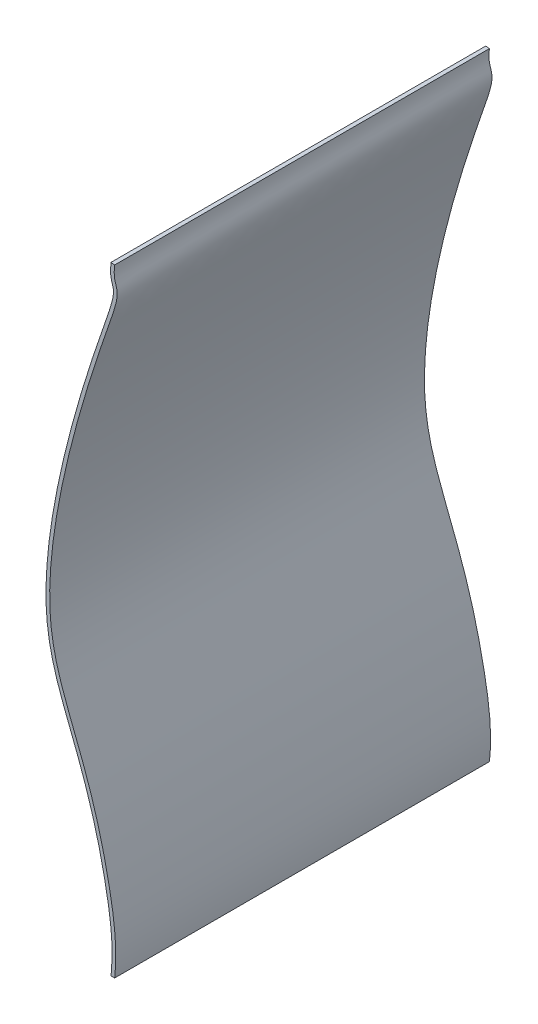
ISO-10303-21;
HEADER;
FILE_DESCRIPTION(('STEP AP214'),'2;1');
FILE_NAME('part.step','',(''),(''),'','','');
FILE_SCHEMA(('AUTOMOTIVE_DESIGN { 1 0 10303 214 1 1 1 1 }'));
ENDSEC;
DATA;
#1=APPLICATION_CONTEXT('core data for automotive mechanical design processes');
#2=APPLICATION_PROTOCOL_DEFINITION('international standard','automotive_design',2000,#1);
#3=PRODUCT_CONTEXT('',#1,'mechanical');
#4=PRODUCT('Part','Part','',(#3));
#5=PRODUCT_RELATED_PRODUCT_CATEGORY('part','',(#4));
#6=PRODUCT_DEFINITION_FORMATION('','',#4);
#7=PRODUCT_DEFINITION_CONTEXT('part definition',#1,'design');
#8=PRODUCT_DEFINITION('design','',#6,#7);
#9=PRODUCT_DEFINITION_SHAPE('','',#8);
#10=(LENGTH_UNIT() NAMED_UNIT(*) SI_UNIT(.MILLI.,.METRE.));
#11=(NAMED_UNIT(*) PLANE_ANGLE_UNIT() SI_UNIT($,.RADIAN.));
#12=(NAMED_UNIT(*) SI_UNIT($,.STERADIAN.) SOLID_ANGLE_UNIT());
#13=UNCERTAINTY_MEASURE_WITH_UNIT(LENGTH_MEASURE(1.E-05),#10,'distance_accuracy_value','');
#14=(GEOMETRIC_REPRESENTATION_CONTEXT(3) GLOBAL_UNCERTAINTY_ASSIGNED_CONTEXT((#13)) GLOBAL_UNIT_ASSIGNED_CONTEXT((#10,
#11,#12)) REPRESENTATION_CONTEXT('',''));
#15=CARTESIAN_POINT('',(0.,0.,0.));
#16=DIRECTION('',(0.,0.,1.));
#17=DIRECTION('',(1.,0.,0.));
#18=AXIS2_PLACEMENT_3D('',#15,#16,#17);
#19=CARTESIAN_POINT('',(0.,50.2835955974899,30.5));
#20=CARTESIAN_POINT('',(-0.18373466554615,48.6532127867403,30.5));
#21=CARTESIAN_POINT('',(0.734674187649838,49.1493128448478,30.5));
#22=CARTESIAN_POINT('',(-3.40129705536355,37.7497003443111,30.5));
#23=CARTESIAN_POINT('',(-7.54473575919146,19.8668850322596,30.5));
#24=CARTESIAN_POINT('',(-1.83725524198028,14.8111719739565,30.5));
#25=CARTESIAN_POINT('',(0.272675027492212,2.11366446405727,30.5));
#26=CARTESIAN_POINT('',(0.00741460513694067,0.0700394713873854,30.5));
#27=CARTESIAN_POINT('',(0.,0.,30.5));
#28=B_SPLINE_CURVE_WITH_KNOTS('',3,(#19,#20,#21,#22,#23,#24,#25,#26,#27),.UNSPECIFIED.,.F.,.F.,
(4,1,1,1,1,1,4),(0.,0.0920467939800354,0.141878839632011,0.498320456519752,0.877390740446924,
0.927558694794949,1.),.UNSPECIFIED.);
#29=DIRECTION('',(0.,0.,-1.));
#30=VECTOR('',#29,1.);
#31=SURFACE_OF_LINEAR_EXTRUSION('',#28,#30);
#32=CARTESIAN_POINT('',(0.,50.2835955974899,0.));
#33=CARTESIAN_POINT('',(-0.18373466554615,48.6532127867403,0.));
#34=CARTESIAN_POINT('',(0.734674187649838,49.1493128448478,0.));
#35=CARTESIAN_POINT('',(-3.40129705536355,37.7497003443111,0.));
#36=CARTESIAN_POINT('',(-7.54473575919146,19.8668850322596,0.));
#37=CARTESIAN_POINT('',(-1.83725524198028,14.8111719739565,0.));
#38=CARTESIAN_POINT('',(0.272675027492212,2.11366446405727,0.));
#39=CARTESIAN_POINT('',(0.00741460513694067,0.0700394713873854,0.));
#40=CARTESIAN_POINT('',(0.,0.,0.));
#41=B_SPLINE_CURVE_WITH_KNOTS('',3,(#32,#33,#34,#35,#36,#37,#38,#39,#40),.UNSPECIFIED.,.F.,.F.,
(4,1,1,1,1,1,4),(0.,0.0920467939800354,0.141878839632011,0.498320456519752,0.877390740446924,
0.927558694794949,1.),.UNSPECIFIED.);
#42=CARTESIAN_POINT('',(0.,50.2835955974899,0.));
#43=VERTEX_POINT('',#42);
#44=CARTESIAN_POINT('',(0.,0.,0.));
#45=VERTEX_POINT('',#44);
#46=EDGE_CURVE('E118',#43,#45,#41,.T.);
#47=ORIENTED_EDGE('',*,*,#46,.T.);
#48=DIRECTION('',(0.,0.,-1.));
#49=VECTOR('',#48,1.);
#50=CARTESIAN_POINT('',(0.,0.,30.5));
#51=LINE('',#50,#49);
#52=CARTESIAN_POINT('',(0.,0.,30.5));
#53=VERTEX_POINT('',#52);
#54=EDGE_CURVE('E11',#53,#45,#51,.T.);
#55=ORIENTED_EDGE('',*,*,#54,.F.);
#56=CARTESIAN_POINT('',(0.,50.2835955974899,30.5));
#57=VERTEX_POINT('',#56);
#58=EDGE_CURVE('E87',#57,#53,#28,.T.);
#59=ORIENTED_EDGE('',*,*,#58,.F.);
#60=DIRECTION('',(0.,0.,-1.));
#61=VECTOR('',#60,1.);
#62=CARTESIAN_POINT('',(0.,50.2835955974899,30.5));
#63=LINE('',#62,#61);
#64=EDGE_CURVE('E95',#57,#43,#63,.T.);
#65=ORIENTED_EDGE('',*,*,#64,.T.);
#66=EDGE_LOOP('',(#47,#55,#59,#65));
#67=FACE_BOUND('',#66,.T.);
#68=ADVANCED_FACE('F35',(#67),#31,.F.);
#69=CARTESIAN_POINT('',(0.302004613028697,6.91656611541761E-12,30.5));
#70=DIRECTION('',(-2.2902186976728E-11,1.,0.));
#71=DIRECTION('',(-1.,-2.2902186976728E-11,0.));
#72=AXIS2_PLACEMENT_3D('',#69,#70,#71);
#73=PLANE('',#72);
#74=DIRECTION('',(1.,2.2902186976728E-11,0.));
#75=VECTOR('',#74,1.);
#76=CARTESIAN_POINT('',(0.302004613028697,6.91656611541761E-12,0.));
#77=LINE('',#76,#75);
#78=CARTESIAN_POINT('',(0.302004613028635,6.91460269304587E-12,0.));
#79=VERTEX_POINT('',#78);
#80=EDGE_CURVE('E91',#45,#79,#77,.T.);
#81=ORIENTED_EDGE('',*,*,#80,.T.);
#82=DIRECTION('',(0.,0.,-1.));
#83=VECTOR('',#82,1.);
#84=CARTESIAN_POINT('',(0.302004613028635,6.91460269304587E-12,30.5));
#85=LINE('',#84,#83);
#86=CARTESIAN_POINT('',(0.302004613028635,6.91460269304587E-12,30.5));
#87=VERTEX_POINT('',#86);
#88=EDGE_CURVE('E44',#87,#79,#85,.T.);
#89=ORIENTED_EDGE('',*,*,#88,.F.);
#90=DIRECTION('',(1.,2.2902186976728E-11,0.));
#91=VECTOR('',#90,1.);
#92=CARTESIAN_POINT('',(0.302004613028697,6.91656611541761E-12,30.5));
#93=LINE('',#92,#91);
#94=EDGE_CURVE('E82',#53,#87,#93,.T.);
#95=ORIENTED_EDGE('',*,*,#94,.F.);
#96=ORIENTED_EDGE('',*,*,#54,.T.);
#97=EDGE_LOOP('',(#81,#89,#95,#96));
#98=FACE_BOUND('',#97,.T.);
#99=ADVANCED_FACE('F90',(#98),#73,.F.);
#100=CARTESIAN_POINT('',(0.298382613163943,-0.031611140627497,30.5));
#101=CARTESIAN_POINT('',(0.300541780155808,-0.0114197163662745,30.5));
#102=CARTESIAN_POINT('',(0.303358634806105,0.00908176957020213,30.5));
#103=CARTESIAN_POINT('',(0.325096497427992,0.208680537449966,30.5));
#104=CARTESIAN_POINT('',(0.360339558184762,0.60941338963754,30.5));
#105=CARTESIAN_POINT('',(0.39317299624008,1.32585395055915,30.5));
#106=CARTESIAN_POINT('',(0.39332935039402,2.51982339538144,30.5));
#107=CARTESIAN_POINT('',(0.214303415007665,4.35357574780625,30.5));
#108=CARTESIAN_POINT('',(-0.206611220102496,6.65109316182661,30.5));
#109=CARTESIAN_POINT('',(-0.658612270936142,8.67792033567654,30.5));
#110=CARTESIAN_POINT('',(-1.30433556380128,11.0879486290271,30.5));
#111=CARTESIAN_POINT('',(-2.15447838088516,13.618038968921,30.5));
#112=CARTESIAN_POINT('',(-3.14813046234126,16.1338790392636,30.5));
#113=CARTESIAN_POINT('',(-4.01627399380895,18.3755094909161,30.5));
#114=CARTESIAN_POINT('',(-4.66795207346639,20.5968722581987,30.5));
#115=CARTESIAN_POINT('',(-5.02070969853238,23.0605167776207,30.5));
#116=CARTESIAN_POINT('',(-4.98268938634552,26.0542385870957,30.5));
#117=CARTESIAN_POINT('',(-4.58492107218778,29.4956078379904,30.5));
#118=CARTESIAN_POINT('',(-3.86627117139684,33.2848609216382,30.5));
#119=CARTESIAN_POINT('',(-3.03187597351498,36.6569227397343,30.5));
#120=CARTESIAN_POINT('',(-2.24382204699352,39.4353684315994,30.5));
#121=CARTESIAN_POINT('',(-1.59479104690653,41.5527576212835,30.5));
#122=CARTESIAN_POINT('',(-0.903532086344598,43.6738557796574,30.5));
#123=CARTESIAN_POINT('',(-0.134378046528336,45.8565622342375,30.5));
#124=CARTESIAN_POINT('',(0.392907088757714,47.4281199666547,30.5));
#125=CARTESIAN_POINT('',(0.521333525862178,48.1993832329077,30.5));
#126=CARTESIAN_POINT('',(0.490994847139368,48.6307322094167,30.5));
#127=CARTESIAN_POINT('',(0.388743590183615,48.9480516808791,30.5));
#128=CARTESIAN_POINT('',(0.305295056304236,49.2042271639559,30.5));
#129=CARTESIAN_POINT('',(0.262235656426214,49.514746660819,30.5));
#130=CARTESIAN_POINT('',(0.263569773390414,49.8750501987511,30.5));
#131=CARTESIAN_POINT('',(0.284785760328283,50.131739048232,30.5));
#132=CARTESIAN_POINT('',(0.298112958170645,50.25,30.5));
#133=B_SPLINE_CURVE_WITH_KNOTS('',3,(#100,#101,#102,#103,#104,#105,#106,#107,#108,#109,#110,
#111,#112,#113,#114,#115,#116,#117,#118,#119,#120,#121,#122,#123,#124,#125,#126,#127,#128,#129,
#130,#131,#132),.UNSPECIFIED.,.F.,.F.,(4,1,1,1,1,1,1,1,1,1,1,1,1,1,1,1,1,1,1,1,1,1,1,1,1,1,1,1,
1,1,4),(0.,0.00781172547123832,0.0156234509424767,0.0312469018849536,0.0468703528274304,
0.0624938037699071,0.0937407056548607,0.124987607539814,0.156234509424768,0.187481411309721,
0.249975215079628,0.312469018849536,0.374962822619443,0.43745662638935,0.499950430159257,
0.562444233929164,0.624938037699071,0.687431841468978,0.749925645238885,0.781172547123839,
0.812419449008793,0.843666350893746,0.8749132527787,0.906160154663653,0.92178360560613,
0.937407056548607,0.953030507491084,0.96865395843356,0.984277409376037,0.992089134847275,
0.999900860318514),.UNSPECIFIED.);
#134=DIRECTION('',(0.,0.,-1.));
#135=VECTOR('',#134,1.);
#136=SURFACE_OF_LINEAR_EXTRUSION('',#133,#135);
#137=CARTESIAN_POINT('',(0.298382613163943,-0.031611140627497,0.));
#138=CARTESIAN_POINT('',(0.300541780155808,-0.0114197163662745,0.));
#139=CARTESIAN_POINT('',(0.303358634806105,0.00908176957020213,0.));
#140=CARTESIAN_POINT('',(0.325096497427992,0.208680537449966,0.));
#141=CARTESIAN_POINT('',(0.360339558184762,0.60941338963754,0.));
#142=CARTESIAN_POINT('',(0.39317299624008,1.32585395055915,0.));
#143=CARTESIAN_POINT('',(0.39332935039402,2.51982339538144,0.));
#144=CARTESIAN_POINT('',(0.214303415007665,4.35357574780625,0.));
#145=CARTESIAN_POINT('',(-0.206611220102496,6.65109316182661,0.));
#146=CARTESIAN_POINT('',(-0.658612270936142,8.67792033567654,0.));
#147=CARTESIAN_POINT('',(-1.30433556380128,11.0879486290271,0.));
#148=CARTESIAN_POINT('',(-2.15447838088516,13.618038968921,0.));
#149=CARTESIAN_POINT('',(-3.14813046234126,16.1338790392636,0.));
#150=CARTESIAN_POINT('',(-4.01627399380895,18.3755094909161,0.));
#151=CARTESIAN_POINT('',(-4.66795207346639,20.5968722581987,0.));
#152=CARTESIAN_POINT('',(-5.02070969853238,23.0605167776207,0.));
#153=CARTESIAN_POINT('',(-4.98268938634552,26.0542385870957,0.));
#154=CARTESIAN_POINT('',(-4.58492107218778,29.4956078379904,0.));
#155=CARTESIAN_POINT('',(-3.86627117139684,33.2848609216382,0.));
#156=CARTESIAN_POINT('',(-3.03187597351498,36.6569227397343,0.));
#157=CARTESIAN_POINT('',(-2.24382204699352,39.4353684315994,0.));
#158=CARTESIAN_POINT('',(-1.59479104690653,41.5527576212835,0.));
#159=CARTESIAN_POINT('',(-0.903532086344598,43.6738557796574,0.));
#160=CARTESIAN_POINT('',(-0.134378046528336,45.8565622342375,0.));
#161=CARTESIAN_POINT('',(0.392907088757714,47.4281199666547,0.));
#162=CARTESIAN_POINT('',(0.521333525862178,48.1993832329077,0.));
#163=CARTESIAN_POINT('',(0.490994847139368,48.6307322094167,0.));
#164=CARTESIAN_POINT('',(0.388743590183615,48.9480516808791,0.));
#165=CARTESIAN_POINT('',(0.305295056304236,49.2042271639559,0.));
#166=CARTESIAN_POINT('',(0.262235656426214,49.514746660819,0.));
#167=CARTESIAN_POINT('',(0.263569773390414,49.8750501987511,0.));
#168=CARTESIAN_POINT('',(0.284785760328283,50.131739048232,0.));
#169=CARTESIAN_POINT('',(0.298112958170645,50.25,0.));
#170=B_SPLINE_CURVE_WITH_KNOTS('',3,(#137,#138,#139,#140,#141,#142,#143,#144,#145,#146,#147,
#148,#149,#150,#151,#152,#153,#154,#155,#156,#157,#158,#159,#160,#161,#162,#163,#164,#165,#166,
#167,#168,#169),.UNSPECIFIED.,.F.,.F.,(4,1,1,1,1,1,1,1,1,1,1,1,1,1,1,1,1,1,1,1,1,1,1,1,1,1,1,1,
1,1,4),(0.,0.00781172547123832,0.0156234509424767,0.0312469018849536,0.0468703528274304,
0.0624938037699071,0.0937407056548607,0.124987607539814,0.156234509424768,0.187481411309721,
0.249975215079628,0.312469018849536,0.374962822619443,0.43745662638935,0.499950430159257,
0.562444233929164,0.624938037699071,0.687431841468978,0.749925645238885,0.781172547123839,
0.812419449008793,0.843666350893746,0.8749132527787,0.906160154663653,0.92178360560613,
0.937407056548607,0.953030507491084,0.96865395843356,0.984277409376037,0.992089134847275,
0.999900860318514),.UNSPECIFIED.);
#171=CARTESIAN_POINT('',(0.298112958170714,50.25,0.));
#172=VERTEX_POINT('',#171);
#173=EDGE_CURVE('E69',#79,#172,#170,.T.);
#174=ORIENTED_EDGE('',*,*,#173,.T.);
#175=DIRECTION('',(0.,0.,-1.));
#176=VECTOR('',#175,1.);
#177=CARTESIAN_POINT('',(0.298112958170714,50.25,30.5));
#178=LINE('',#177,#176);
#179=CARTESIAN_POINT('',(0.298112958170714,50.25,30.5));
#180=VERTEX_POINT('',#179);
#181=EDGE_CURVE('E92',#180,#172,#178,.T.);
#182=ORIENTED_EDGE('',*,*,#181,.F.);
#183=EDGE_CURVE('E85',#87,#180,#133,.T.);
#184=ORIENTED_EDGE('',*,*,#183,.F.);
#185=ORIENTED_EDGE('',*,*,#88,.T.);
#186=EDGE_LOOP('',(#174,#182,#184,#185));
#187=FACE_BOUND('',#186,.T.);
#188=ADVANCED_FACE('F93',(#187),#136,.F.);
#189=CARTESIAN_POINT('',(0.,50.2835955974899,30.5));
#190=DIRECTION('',(-0.111985324966479,-0.993709860569045,0.));
#191=DIRECTION('',(0.993709860569046,-0.111985324966479,0.));
#192=AXIS2_PLACEMENT_3D('',#189,#190,#191);
#193=PLANE('',#192);
#194=DIRECTION('',(-0.993709860569046,0.111985324966479,0.));
#195=VECTOR('',#194,1.);
#196=CARTESIAN_POINT('',(0.,50.2835955974899,0.));
#197=LINE('',#196,#195);
#198=EDGE_CURVE('E75',#172,#43,#197,.T.);
#199=ORIENTED_EDGE('',*,*,#198,.T.);
#200=ORIENTED_EDGE('',*,*,#64,.F.);
#201=DIRECTION('',(-0.993709860569046,0.111985324966479,0.));
#202=VECTOR('',#201,1.);
#203=CARTESIAN_POINT('',(0.,50.2835955974899,30.5));
#204=LINE('',#203,#202);
#205=EDGE_CURVE('E52',#180,#57,#204,.T.);
#206=ORIENTED_EDGE('',*,*,#205,.F.);
#207=ORIENTED_EDGE('',*,*,#181,.T.);
#208=EDGE_LOOP('',(#199,#200,#206,#207));
#209=FACE_BOUND('',#208,.T.);
#210=ADVANCED_FACE('F107',(#209),#193,.F.);
#211=CARTESIAN_POINT('',(-5.25497734663496,23.1293158488973,30.5));
#212=DIRECTION('',(0.,0.,-1.));
#213=DIRECTION('',(-1.,0.,0.));
#214=AXIS2_PLACEMENT_3D('',#211,#212,#213);
#215=PLANE('',#214);
#216=ORIENTED_EDGE('',*,*,#58,.T.);
#217=ORIENTED_EDGE('',*,*,#94,.T.);
#218=ORIENTED_EDGE('',*,*,#183,.T.);
#219=ORIENTED_EDGE('',*,*,#205,.T.);
#220=EDGE_LOOP('',(#216,#217,#218,#219));
#221=FACE_BOUND('',#220,.T.);
#222=ADVANCED_FACE('F83',(#221),#215,.F.);
#223=CARTESIAN_POINT('',(-5.25497734663496,23.1293158488973,0.));
#224=DIRECTION('',(0.,0.,-1.));
#225=DIRECTION('',(-1.,0.,0.));
#226=AXIS2_PLACEMENT_3D('',#223,#224,#225);
#227=PLANE('',#226);
#228=ORIENTED_EDGE('',*,*,#46,.F.);
#229=ORIENTED_EDGE('',*,*,#198,.F.);
#230=ORIENTED_EDGE('',*,*,#173,.F.);
#231=ORIENTED_EDGE('',*,*,#80,.F.);
#232=EDGE_LOOP('',(#228,#229,#230,#231));
#233=FACE_BOUND('',#232,.T.);
#234=ADVANCED_FACE('F135',(#233),#227,.T.);
#235=CLOSED_SHELL('',(#68,#99,#188,#210,#222,#234));
#236=MANIFOLD_SOLID_BREP('B2',#235);
#237=ADVANCED_BREP_SHAPE_REPRESENTATION('',(#18,#236),#14);
#238=SHAPE_DEFINITION_REPRESENTATION(#9,#237);
ENDSEC;
END-ISO-10303-21;
